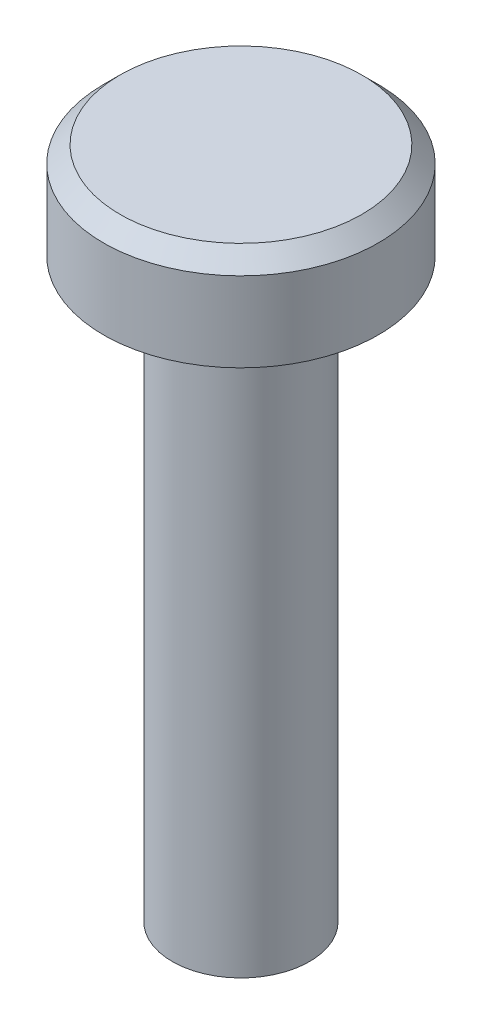
ISO-10303-21;
HEADER;
FILE_DESCRIPTION(('STEP AP214'),'2;1');
FILE_NAME('part.step','',(''),(''),'','','');
FILE_SCHEMA(('AUTOMOTIVE_DESIGN { 1 0 10303 214 1 1 1 1 }'));
ENDSEC;
DATA;
#1=APPLICATION_CONTEXT('core data for automotive mechanical design processes');
#2=APPLICATION_PROTOCOL_DEFINITION('international standard','automotive_design',2000,#1);
#3=PRODUCT_CONTEXT('',#1,'mechanical');
#4=PRODUCT('Part','Part','',(#3));
#5=PRODUCT_RELATED_PRODUCT_CATEGORY('part','',(#4));
#6=PRODUCT_DEFINITION_FORMATION('','',#4);
#7=PRODUCT_DEFINITION_CONTEXT('part definition',#1,'design');
#8=PRODUCT_DEFINITION('design','',#6,#7);
#9=PRODUCT_DEFINITION_SHAPE('','',#8);
#10=(LENGTH_UNIT() NAMED_UNIT(*) SI_UNIT(.MILLI.,.METRE.));
#11=(NAMED_UNIT(*) PLANE_ANGLE_UNIT() SI_UNIT($,.RADIAN.));
#12=(NAMED_UNIT(*) SI_UNIT($,.STERADIAN.) SOLID_ANGLE_UNIT());
#13=UNCERTAINTY_MEASURE_WITH_UNIT(LENGTH_MEASURE(1.E-05),#10,'distance_accuracy_value','');
#14=(GEOMETRIC_REPRESENTATION_CONTEXT(3) GLOBAL_UNCERTAINTY_ASSIGNED_CONTEXT((#13)) GLOBAL_UNIT_ASSIGNED_CONTEXT((#10,
#11,#12)) REPRESENTATION_CONTEXT('',''));
#15=CARTESIAN_POINT('',(0.,0.,0.));
#16=DIRECTION('',(0.,0.,1.));
#17=DIRECTION('',(1.,0.,0.));
#18=AXIS2_PLACEMENT_3D('',#15,#16,#17);
#19=CARTESIAN_POINT('',(0.,0.,0.));
#20=DIRECTION('',(0.,-1.,0.));
#21=DIRECTION('',(1.,0.,0.));
#22=AXIS2_PLACEMENT_3D('',#19,#20,#21);
#23=PLANE('',#22);
#24=CARTESIAN_POINT('',(0.,0.,0.));
#25=DIRECTION('',(0.,1.,0.));
#26=DIRECTION('',(-1.,0.,0.));
#27=AXIS2_PLACEMENT_3D('',#24,#25,#26);
#28=CIRCLE('',#27,4.4);
#29=CARTESIAN_POINT('',(-4.4,0.,0.));
#30=VERTEX_POINT('',#29);
#31=EDGE_CURVE('E10',#30,#30,#28,.T.);
#32=ORIENTED_EDGE('',*,*,#31,.T.);
#33=EDGE_LOOP('',(#32));
#34=FACE_BOUND('',#33,.T.);
#35=ADVANCED_FACE('F31',(#34),#23,.F.);
#36=CARTESIAN_POINT('',(0.,-0.600000000000001,0.));
#37=DIRECTION('',(0.,-1.,0.));
#38=DIRECTION('',(1.,0.,0.));
#39=AXIS2_PLACEMENT_3D('',#36,#37,#38);
#40=CONICAL_SURFACE('',#39,5.,0.785398163397448);
#41=ORIENTED_EDGE('',*,*,#31,.F.);
#42=EDGE_LOOP('',(#41));
#43=FACE_BOUND('',#42,.T.);
#44=CARTESIAN_POINT('',(0.,-0.600000000000001,0.));
#45=DIRECTION('',(0.,1.,0.));
#46=DIRECTION('',(-1.,0.,0.));
#47=AXIS2_PLACEMENT_3D('',#44,#45,#46);
#48=CIRCLE('',#47,5.);
#49=CARTESIAN_POINT('',(-5.,-0.600000000000001,0.));
#50=VERTEX_POINT('',#49);
#51=EDGE_CURVE('E37',#50,#50,#48,.T.);
#52=ORIENTED_EDGE('',*,*,#51,.T.);
#53=EDGE_LOOP('',(#52));
#54=FACE_BOUND('',#53,.T.);
#55=ADVANCED_FACE('F66',(#43,#54),#40,.T.);
#56=CARTESIAN_POINT('',(0.,0.,0.));
#57=DIRECTION('',(0.,1.,0.));
#58=DIRECTION('',(-1.,0.,0.));
#59=AXIS2_PLACEMENT_3D('',#56,#57,#58);
#60=CYLINDRICAL_SURFACE('',#59,5.);
#61=ORIENTED_EDGE('',*,*,#51,.F.);
#62=EDGE_LOOP('',(#61));
#63=FACE_BOUND('',#62,.T.);
#64=CARTESIAN_POINT('',(0.,-3.5,0.));
#65=DIRECTION('',(0.,1.,0.));
#66=DIRECTION('',(-1.,0.,0.));
#67=AXIS2_PLACEMENT_3D('',#64,#65,#66);
#68=CIRCLE('',#67,5.);
#69=CARTESIAN_POINT('',(-5.,-3.5,0.));
#70=VERTEX_POINT('',#69);
#71=EDGE_CURVE('E41',#70,#70,#68,.T.);
#72=ORIENTED_EDGE('',*,*,#71,.T.);
#73=EDGE_LOOP('',(#72));
#74=FACE_BOUND('',#73,.T.);
#75=ADVANCED_FACE('F70',(#63,#74),#60,.T.);
#76=CARTESIAN_POINT('',(5.,-3.5,0.));
#77=DIRECTION('',(0.,1.,0.));
#78=DIRECTION('',(-1.,0.,0.));
#79=AXIS2_PLACEMENT_3D('',#76,#77,#78);
#80=PLANE('',#79);
#81=ORIENTED_EDGE('',*,*,#71,.F.);
#82=EDGE_LOOP('',(#81));
#83=FACE_BOUND('',#82,.T.);
#84=CARTESIAN_POINT('',(0.,-3.5,0.));
#85=DIRECTION('',(0.,1.,0.));
#86=DIRECTION('',(-1.,0.,0.));
#87=AXIS2_PLACEMENT_3D('',#84,#85,#86);
#88=CIRCLE('',#87,2.5);
#89=CARTESIAN_POINT('',(-2.5,-3.5,0.));
#90=VERTEX_POINT('',#89);
#91=EDGE_CURVE('E45',#90,#90,#88,.T.);
#92=ORIENTED_EDGE('',*,*,#91,.T.);
#93=EDGE_LOOP('',(#92));
#94=FACE_BOUND('',#93,.T.);
#95=ADVANCED_FACE('F62',(#83,#94),#80,.F.);
#96=CARTESIAN_POINT('',(0.,0.,0.));
#97=DIRECTION('',(0.,1.,0.));
#98=DIRECTION('',(-1.,0.,0.));
#99=AXIS2_PLACEMENT_3D('',#96,#97,#98);
#100=CYLINDRICAL_SURFACE('',#99,2.5);
#101=ORIENTED_EDGE('',*,*,#91,.F.);
#102=EDGE_LOOP('',(#101));
#103=FACE_BOUND('',#102,.T.);
#104=CARTESIAN_POINT('',(0.,-24.5,0.));
#105=DIRECTION('',(0.,1.,0.));
#106=DIRECTION('',(-1.,0.,0.));
#107=AXIS2_PLACEMENT_3D('',#104,#105,#106);
#108=CIRCLE('',#107,2.5);
#109=CARTESIAN_POINT('',(-2.5,-24.5,0.));
#110=VERTEX_POINT('',#109);
#111=EDGE_CURVE('E50',#110,#110,#108,.T.);
#112=ORIENTED_EDGE('',*,*,#111,.T.);
#113=EDGE_LOOP('',(#112));
#114=FACE_BOUND('',#113,.T.);
#115=ADVANCED_FACE('F54',(#103,#114),#100,.T.);
#116=CARTESIAN_POINT('',(2.5,-24.5,0.));
#117=DIRECTION('',(0.,1.,0.));
#118=DIRECTION('',(-1.,0.,0.));
#119=AXIS2_PLACEMENT_3D('',#116,#117,#118);
#120=PLANE('',#119);
#121=ORIENTED_EDGE('',*,*,#111,.F.);
#122=EDGE_LOOP('',(#121));
#123=FACE_BOUND('',#122,.T.);
#124=ADVANCED_FACE('F56',(#123),#120,.F.);
#125=CLOSED_SHELL('',(#35,#55,#75,#95,#115,#124));
#126=MANIFOLD_SOLID_BREP('B2',#125);
#127=ADVANCED_BREP_SHAPE_REPRESENTATION('',(#18,#126),#14);
#128=SHAPE_DEFINITION_REPRESENTATION(#9,#127);
ENDSEC;
END-ISO-10303-21;
